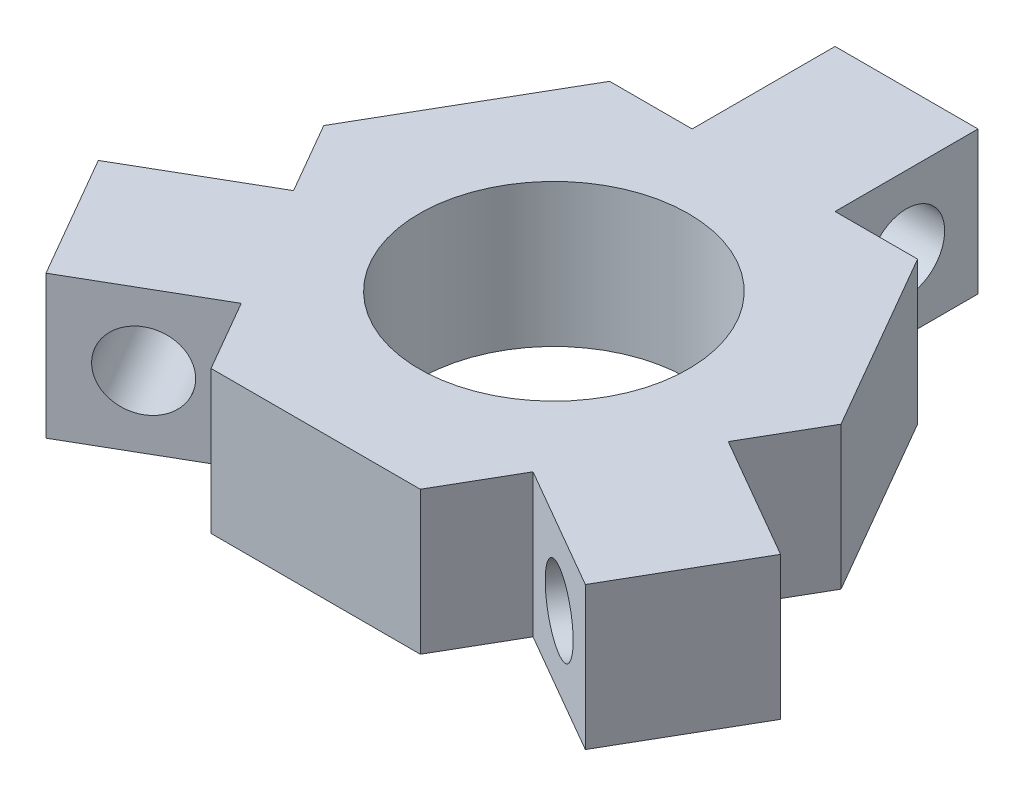
ISO-10303-21;
HEADER;
FILE_DESCRIPTION(('STEP AP214'),'2;1');
FILE_NAME('part.step','',(''),(''),'','','');
FILE_SCHEMA(('AUTOMOTIVE_DESIGN { 1 0 10303 214 1 1 1 1 }'));
ENDSEC;
DATA;
#1=APPLICATION_CONTEXT('core data for automotive mechanical design processes');
#2=APPLICATION_PROTOCOL_DEFINITION('international standard','automotive_design',2000,#1);
#3=PRODUCT_CONTEXT('',#1,'mechanical');
#4=PRODUCT('Part','Part','',(#3));
#5=PRODUCT_RELATED_PRODUCT_CATEGORY('part','',(#4));
#6=PRODUCT_DEFINITION_FORMATION('','',#4);
#7=PRODUCT_DEFINITION_CONTEXT('part definition',#1,'design');
#8=PRODUCT_DEFINITION('design','',#6,#7);
#9=PRODUCT_DEFINITION_SHAPE('','',#8);
#10=(LENGTH_UNIT() NAMED_UNIT(*) SI_UNIT(.MILLI.,.METRE.));
#11=(NAMED_UNIT(*) PLANE_ANGLE_UNIT() SI_UNIT($,.RADIAN.));
#12=(NAMED_UNIT(*) SI_UNIT($,.STERADIAN.) SOLID_ANGLE_UNIT());
#13=UNCERTAINTY_MEASURE_WITH_UNIT(LENGTH_MEASURE(1.E-05),#10,'distance_accuracy_value','');
#14=(GEOMETRIC_REPRESENTATION_CONTEXT(3) GLOBAL_UNCERTAINTY_ASSIGNED_CONTEXT((#13)) GLOBAL_UNIT_ASSIGNED_CONTEXT((#10,
#11,#12)) REPRESENTATION_CONTEXT('',''));
#15=CARTESIAN_POINT('',(0.,0.,0.));
#16=DIRECTION('',(0.,0.,1.));
#17=DIRECTION('',(1.,0.,0.));
#18=AXIS2_PLACEMENT_3D('',#15,#16,#17);
#19=CARTESIAN_POINT('',(-8.66025403784439,6.,-5.));
#20=DIRECTION('',(0.866025403784438,0.,0.5));
#21=DIRECTION('',(0.5,0.,-0.866025403784439));
#22=AXIS2_PLACEMENT_3D('',#19,#20,#21);
#23=PLANE('',#22);
#24=DIRECTION('',(-0.5,0.,0.866025403784439));
#25=VECTOR('',#24,1.);
#26=CARTESIAN_POINT('',(-8.66025403784439,0.,-5.));
#27=LINE('',#26,#25);
#28=CARTESIAN_POINT('',(-6.46410161513776,0.,-8.80384757729336));
#29=VERTEX_POINT('',#28);
#30=CARTESIAN_POINT('',(-10.856406460551,0.,-1.19615242270663));
#31=VERTEX_POINT('',#30);
#32=EDGE_CURVE('E197',#29,#31,#27,.T.);
#33=ORIENTED_EDGE('',*,*,#32,.T.);
#34=DIRECTION('',(0.,-1.,0.));
#35=VECTOR('',#34,1.);
#36=CARTESIAN_POINT('',(-10.856406460551,6.,-1.19615242270663));
#37=LINE('',#36,#35);
#38=CARTESIAN_POINT('',(-10.856406460551,6.,-1.19615242270663));
#39=VERTEX_POINT('',#38);
#40=EDGE_CURVE('E11',#39,#31,#37,.T.);
#41=ORIENTED_EDGE('',*,*,#40,.F.);
#42=DIRECTION('',(-0.5,0.,0.866025403784439));
#43=VECTOR('',#42,1.);
#44=CARTESIAN_POINT('',(-8.66025403784439,6.,-5.));
#45=LINE('',#44,#43);
#46=CARTESIAN_POINT('',(-6.46410161513776,6.,-8.80384757729336));
#47=VERTEX_POINT('',#46);
#48=EDGE_CURVE('E316',#47,#39,#45,.T.);
#49=ORIENTED_EDGE('',*,*,#48,.F.);
#50=DIRECTION('',(0.,-1.,0.));
#51=VECTOR('',#50,1.);
#52=CARTESIAN_POINT('',(-6.46410161513776,6.,-8.80384757729336));
#53=LINE('',#52,#51);
#54=EDGE_CURVE('E55',#47,#29,#53,.T.);
#55=ORIENTED_EDGE('',*,*,#54,.T.);
#56=EDGE_LOOP('',(#33,#41,#49,#55));
#57=FACE_BOUND('',#56,.T.);
#58=ADVANCED_FACE('F39',(#57),#23,.F.);
#59=CARTESIAN_POINT('',(-7.62435565298214,6.,4.40192378864669));
#60=DIRECTION('',(0.866025403784439,0.,-0.5));
#61=DIRECTION('',(-0.5,0.,-0.866025403784439));
#62=AXIS2_PLACEMENT_3D('',#59,#60,#61);
#63=PLANE('',#62);
#64=DIRECTION('',(0.5,0.,0.866025403784439));
#65=VECTOR('',#64,1.);
#66=CARTESIAN_POINT('',(-7.62435565298214,0.,4.40192378864669));
#67=LINE('',#66,#65);
#68=CARTESIAN_POINT('',(-9.12435565298214,0.,1.80384757729337));
#69=VERTEX_POINT('',#68);
#70=EDGE_CURVE('E199',#31,#69,#67,.T.);
#71=ORIENTED_EDGE('',*,*,#70,.T.);
#72=DIRECTION('',(0.,-1.,0.));
#73=VECTOR('',#72,1.);
#74=CARTESIAN_POINT('',(-9.12435565298214,6.,1.80384757729337));
#75=LINE('',#74,#73);
#76=CARTESIAN_POINT('',(-9.12435565298214,6.,1.80384757729337));
#77=VERTEX_POINT('',#76);
#78=EDGE_CURVE('E47',#77,#69,#75,.T.);
#79=ORIENTED_EDGE('',*,*,#78,.F.);
#80=DIRECTION('',(0.5,0.,0.866025403784439));
#81=VECTOR('',#80,1.);
#82=CARTESIAN_POINT('',(-7.62435565298214,6.,4.40192378864669));
#83=LINE('',#82,#81);
#84=EDGE_CURVE('E123',#39,#77,#83,.T.);
#85=ORIENTED_EDGE('',*,*,#84,.F.);
#86=ORIENTED_EDGE('',*,*,#40,.T.);
#87=EDGE_LOOP('',(#71,#79,#85,#86));
#88=FACE_BOUND('',#87,.T.);
#89=ADVANCED_FACE('F366',(#88),#63,.F.);
#90=CARTESIAN_POINT('',(-1.5,6.,-2.59807621135331));
#91=DIRECTION('',(0.5,0.,0.866025403784438));
#92=DIRECTION('',(0.866025403784439,0.,-0.5));
#93=AXIS2_PLACEMENT_3D('',#90,#91,#92);
#94=PLANE('',#93);
#95=CARTESIAN_POINT('',(-11.7224318643355,3.,3.30384757729338));
#96=DIRECTION('',(-0.5,0.,-0.866025403784439));
#97=DIRECTION('',(-0.866025403784439,0.,0.5));
#98=AXIS2_PLACEMENT_3D('',#95,#96,#97);
#99=CIRCLE('',#98,1.6);
#100=CARTESIAN_POINT('',(-13.1080725103906,3.,4.10384757729338));
#101=VERTEX_POINT('',#100);
#102=EDGE_CURVE('E320',#101,#101,#99,.T.);
#103=ORIENTED_EDGE('',*,*,#102,.F.);
#104=EDGE_LOOP('',(#103));
#105=FACE_BOUND('',#104,.T.);
#106=DIRECTION('',(-0.866025403784439,0.,0.5));
#107=VECTOR('',#106,1.);
#108=CARTESIAN_POINT('',(-1.5,0.,-2.59807621135331));
#109=LINE('',#108,#107);
#110=CARTESIAN_POINT('',(-14.3205080756888,0.,4.80384757729338));
#111=VERTEX_POINT('',#110);
#112=EDGE_CURVE('E202',#69,#111,#109,.T.);
#113=ORIENTED_EDGE('',*,*,#112,.T.);
#114=DIRECTION('',(0.,-1.,0.));
#115=VECTOR('',#114,1.);
#116=CARTESIAN_POINT('',(-14.3205080756888,6.,4.80384757729338));
#117=LINE('',#116,#115);
#118=CARTESIAN_POINT('',(-14.3205080756888,6.,4.80384757729338));
#119=VERTEX_POINT('',#118);
#120=EDGE_CURVE('E267',#119,#111,#117,.T.);
#121=ORIENTED_EDGE('',*,*,#120,.F.);
#122=DIRECTION('',(-0.866025403784439,0.,0.5));
#123=VECTOR('',#122,1.);
#124=CARTESIAN_POINT('',(-1.5,6.,-2.59807621135331));
#125=LINE('',#124,#123);
#126=EDGE_CURVE('E275',#77,#119,#125,.T.);
#127=ORIENTED_EDGE('',*,*,#126,.F.);
#128=ORIENTED_EDGE('',*,*,#78,.T.);
#129=EDGE_LOOP('',(#113,#121,#127,#128));
#130=FACE_BOUND('',#129,.T.);
#131=ADVANCED_FACE('F273',(#105,#130),#94,.F.);
#132=CARTESIAN_POINT('',(-12.8205080756888,6.,7.40192378864669));
#133=DIRECTION('',(0.866025403784438,0.,-0.5));
#134=DIRECTION('',(-0.5,0.,-0.866025403784439));
#135=AXIS2_PLACEMENT_3D('',#132,#133,#134);
#136=PLANE('',#135);
#137=DIRECTION('',(0.5,0.,0.866025403784439));
#138=VECTOR('',#137,1.);
#139=CARTESIAN_POINT('',(-12.8205080756888,0.,7.40192378864669));
#140=LINE('',#139,#138);
#141=CARTESIAN_POINT('',(-11.3205080756888,0.,10.));
#142=VERTEX_POINT('',#141);
#143=EDGE_CURVE('E205',#111,#142,#140,.T.);
#144=ORIENTED_EDGE('',*,*,#143,.T.);
#145=DIRECTION('',(0.,-1.,0.));
#146=VECTOR('',#145,1.);
#147=CARTESIAN_POINT('',(-11.3205080756888,6.,10.));
#148=LINE('',#147,#146);
#149=CARTESIAN_POINT('',(-11.3205080756888,6.,10.));
#150=VERTEX_POINT('',#149);
#151=EDGE_CURVE('E264',#150,#142,#148,.T.);
#152=ORIENTED_EDGE('',*,*,#151,.F.);
#153=DIRECTION('',(0.5,0.,0.866025403784439));
#154=VECTOR('',#153,1.);
#155=CARTESIAN_POINT('',(-12.8205080756888,6.,7.40192378864669));
#156=LINE('',#155,#154);
#157=EDGE_CURVE('E292',#119,#150,#156,.T.);
#158=ORIENTED_EDGE('',*,*,#157,.F.);
#159=ORIENTED_EDGE('',*,*,#120,.T.);
#160=EDGE_LOOP('',(#144,#152,#158,#159));
#161=FACE_BOUND('',#160,.T.);
#162=ADVANCED_FACE('F283',(#161),#136,.F.);
#163=CARTESIAN_POINT('',(1.5,6.,2.59807621135332));
#164=DIRECTION('',(-0.5,0.,-0.866025403784438));
#165=DIRECTION('',(-0.866025403784439,0.,0.5));
#166=AXIS2_PLACEMENT_3D('',#163,#164,#165);
#167=PLANE('',#166);
#168=CARTESIAN_POINT('',(-8.72243186433546,3.,8.50000000000001));
#169=DIRECTION('',(-0.5,0.,-0.866025403784439));
#170=DIRECTION('',(-0.866025403784439,0.,0.5));
#171=AXIS2_PLACEMENT_3D('',#168,#169,#170);
#172=CIRCLE('',#171,1.6);
#173=CARTESIAN_POINT('',(-10.1080725103906,3.,9.30000000000001));
#174=VERTEX_POINT('',#173);
#175=EDGE_CURVE('E200',#174,#174,#172,.T.);
#176=ORIENTED_EDGE('',*,*,#175,.T.);
#177=EDGE_LOOP('',(#176));
#178=FACE_BOUND('',#177,.T.);
#179=DIRECTION('',(0.866025403784439,0.,-0.5));
#180=VECTOR('',#179,1.);
#181=CARTESIAN_POINT('',(1.5,0.,2.59807621135332));
#182=LINE('',#181,#180);
#183=CARTESIAN_POINT('',(-6.12435565298214,0.,7.00000000000001));
#184=VERTEX_POINT('',#183);
#185=EDGE_CURVE('E207',#142,#184,#182,.T.);
#186=ORIENTED_EDGE('',*,*,#185,.T.);
#187=DIRECTION('',(0.,-1.,0.));
#188=VECTOR('',#187,1.);
#189=CARTESIAN_POINT('',(-6.12435565298214,6.,7.00000000000001));
#190=LINE('',#189,#188);
#191=CARTESIAN_POINT('',(-6.12435565298214,6.,7.00000000000001));
#192=VERTEX_POINT('',#191);
#193=EDGE_CURVE('E261',#192,#184,#190,.T.);
#194=ORIENTED_EDGE('',*,*,#193,.F.);
#195=DIRECTION('',(0.866025403784439,0.,-0.5));
#196=VECTOR('',#195,1.);
#197=CARTESIAN_POINT('',(1.5,6.,2.59807621135332));
#198=LINE('',#197,#196);
#199=EDGE_CURVE('E289',#150,#192,#198,.T.);
#200=ORIENTED_EDGE('',*,*,#199,.F.);
#201=ORIENTED_EDGE('',*,*,#151,.T.);
#202=EDGE_LOOP('',(#186,#194,#200,#201));
#203=FACE_BOUND('',#202,.T.);
#204=ADVANCED_FACE('F287',(#178,#203),#167,.F.);
#205=CARTESIAN_POINT('',(-4.39230484541326,0.,10.));
#206=VERTEX_POINT('',#205);
#207=EDGE_CURVE('E203',#184,#206,#67,.T.);
#208=ORIENTED_EDGE('',*,*,#207,.T.);
#209=DIRECTION('',(0.,-1.,0.));
#210=VECTOR('',#209,1.);
#211=CARTESIAN_POINT('',(-4.39230484541326,6.,10.));
#212=LINE('',#211,#210);
#213=CARTESIAN_POINT('',(-4.39230484541326,6.,10.));
#214=VERTEX_POINT('',#213);
#215=EDGE_CURVE('E258',#214,#206,#212,.T.);
#216=ORIENTED_EDGE('',*,*,#215,.F.);
#217=EDGE_CURVE('E291',#192,#214,#83,.T.);
#218=ORIENTED_EDGE('',*,*,#217,.F.);
#219=ORIENTED_EDGE('',*,*,#193,.T.);
#220=EDGE_LOOP('',(#208,#216,#218,#219));
#221=FACE_BOUND('',#220,.T.);
#222=ADVANCED_FACE('F371',(#221),#63,.F.);
#223=CARTESIAN_POINT('',(0.,6.,10.));
#224=DIRECTION('',(0.,0.,-1.));
#225=DIRECTION('',(-1.,0.,0.));
#226=AXIS2_PLACEMENT_3D('',#223,#224,#225);
#227=PLANE('',#226);
#228=DIRECTION('',(1.,0.,0.));
#229=VECTOR('',#228,1.);
#230=CARTESIAN_POINT('',(0.,0.,10.));
#231=LINE('',#230,#229);
#232=CARTESIAN_POINT('',(4.39230484541327,0.,10.));
#233=VERTEX_POINT('',#232);
#234=EDGE_CURVE('E209',#206,#233,#231,.T.);
#235=ORIENTED_EDGE('',*,*,#234,.T.);
#236=DIRECTION('',(0.,-1.,0.));
#237=VECTOR('',#236,1.);
#238=CARTESIAN_POINT('',(4.39230484541327,6.,10.));
#239=LINE('',#238,#237);
#240=CARTESIAN_POINT('',(4.39230484541327,6.,10.));
#241=VERTEX_POINT('',#240);
#242=EDGE_CURVE('E255',#241,#233,#239,.T.);
#243=ORIENTED_EDGE('',*,*,#242,.F.);
#244=DIRECTION('',(1.,0.,0.));
#245=VECTOR('',#244,1.);
#246=CARTESIAN_POINT('',(0.,6.,10.));
#247=LINE('',#246,#245);
#248=EDGE_CURVE('E294',#214,#241,#247,.T.);
#249=ORIENTED_EDGE('',*,*,#248,.F.);
#250=ORIENTED_EDGE('',*,*,#215,.T.);
#251=EDGE_LOOP('',(#235,#243,#249,#250));
#252=FACE_BOUND('',#251,.T.);
#253=ADVANCED_FACE('F421',(#252),#227,.F.);
#254=CARTESIAN_POINT('',(7.62435565298215,6.,4.40192378864669));
#255=DIRECTION('',(-0.866025403784439,0.,-0.5));
#256=DIRECTION('',(-0.5,0.,0.866025403784439));
#257=AXIS2_PLACEMENT_3D('',#254,#255,#256);
#258=PLANE('',#257);
#259=DIRECTION('',(0.5,0.,-0.866025403784439));
#260=VECTOR('',#259,1.);
#261=CARTESIAN_POINT('',(7.62435565298215,0.,4.40192378864669));
#262=LINE('',#261,#260);
#263=CARTESIAN_POINT('',(6.12435565298215,0.,7.));
#264=VERTEX_POINT('',#263);
#265=EDGE_CURVE('E211',#233,#264,#262,.T.);
#266=ORIENTED_EDGE('',*,*,#265,.T.);
#267=DIRECTION('',(0.,-1.,0.));
#268=VECTOR('',#267,1.);
#269=CARTESIAN_POINT('',(6.12435565298215,6.,7.));
#270=LINE('',#269,#268);
#271=CARTESIAN_POINT('',(6.12435565298215,6.,7.));
#272=VERTEX_POINT('',#271);
#273=EDGE_CURVE('E252',#272,#264,#270,.T.);
#274=ORIENTED_EDGE('',*,*,#273,.F.);
#275=DIRECTION('',(0.5,0.,-0.866025403784439));
#276=VECTOR('',#275,1.);
#277=CARTESIAN_POINT('',(7.62435565298215,6.,4.40192378864669));
#278=LINE('',#277,#276);
#279=EDGE_CURVE('E300',#241,#272,#278,.T.);
#280=ORIENTED_EDGE('',*,*,#279,.F.);
#281=ORIENTED_EDGE('',*,*,#242,.T.);
#282=EDGE_LOOP('',(#266,#274,#280,#281));
#283=FACE_BOUND('',#282,.T.);
#284=ADVANCED_FACE('F417',(#283),#258,.F.);
#285=CARTESIAN_POINT('',(-1.5,6.,2.59807621135332));
#286=DIRECTION('',(0.5,0.,-0.866025403784439));
#287=DIRECTION('',(-0.866025403784439,0.,-0.5));
#288=AXIS2_PLACEMENT_3D('',#285,#286,#287);
#289=PLANE('',#288);
#290=CARTESIAN_POINT('',(8.72243186433546,3.,8.5));
#291=DIRECTION('',(-0.5,0.,0.866025403784439));
#292=DIRECTION('',(0.866025403784439,0.,0.5));
#293=AXIS2_PLACEMENT_3D('',#290,#291,#292);
#294=CIRCLE('',#293,1.6);
#295=CARTESIAN_POINT('',(10.1080725103906,3.,9.3));
#296=VERTEX_POINT('',#295);
#297=EDGE_CURVE('E332',#296,#296,#294,.T.);
#298=ORIENTED_EDGE('',*,*,#297,.F.);
#299=EDGE_LOOP('',(#298));
#300=FACE_BOUND('',#299,.T.);
#301=DIRECTION('',(0.866025403784439,0.,0.5));
#302=VECTOR('',#301,1.);
#303=CARTESIAN_POINT('',(-1.5,0.,2.59807621135332));
#304=LINE('',#303,#302);
#305=CARTESIAN_POINT('',(11.3205080756888,0.,10.));
#306=VERTEX_POINT('',#305);
#307=EDGE_CURVE('E213',#264,#306,#304,.T.);
#308=ORIENTED_EDGE('',*,*,#307,.T.);
#309=DIRECTION('',(0.,-1.,0.));
#310=VECTOR('',#309,1.);
#311=CARTESIAN_POINT('',(11.3205080756888,6.,10.));
#312=LINE('',#311,#310);
#313=CARTESIAN_POINT('',(11.3205080756888,6.,10.));
#314=VERTEX_POINT('',#313);
#315=EDGE_CURVE('E249',#314,#306,#312,.T.);
#316=ORIENTED_EDGE('',*,*,#315,.F.);
#317=DIRECTION('',(0.866025403784439,0.,0.5));
#318=VECTOR('',#317,1.);
#319=CARTESIAN_POINT('',(-1.5,6.,2.59807621135332));
#320=LINE('',#319,#318);
#321=EDGE_CURVE('E302',#272,#314,#320,.T.);
#322=ORIENTED_EDGE('',*,*,#321,.F.);
#323=ORIENTED_EDGE('',*,*,#273,.T.);
#324=EDGE_LOOP('',(#308,#316,#322,#323));
#325=FACE_BOUND('',#324,.T.);
#326=ADVANCED_FACE('F413',(#300,#325),#289,.F.);
#327=CARTESIAN_POINT('',(12.8205080756888,6.,7.40192378864669));
#328=DIRECTION('',(-0.866025403784439,0.,-0.5));
#329=DIRECTION('',(-0.5,0.,0.866025403784439));
#330=AXIS2_PLACEMENT_3D('',#327,#328,#329);
#331=PLANE('',#330);
#332=DIRECTION('',(0.5,0.,-0.866025403784439));
#333=VECTOR('',#332,1.);
#334=CARTESIAN_POINT('',(12.8205080756888,0.,7.40192378864669));
#335=LINE('',#334,#333);
#336=CARTESIAN_POINT('',(14.3205080756888,0.,4.80384757729337));
#337=VERTEX_POINT('',#336);
#338=EDGE_CURVE('E216',#306,#337,#335,.T.);
#339=ORIENTED_EDGE('',*,*,#338,.T.);
#340=DIRECTION('',(0.,-1.,0.));
#341=VECTOR('',#340,1.);
#342=CARTESIAN_POINT('',(14.3205080756888,6.,4.80384757729337));
#343=LINE('',#342,#341);
#344=CARTESIAN_POINT('',(14.3205080756888,6.,4.80384757729337));
#345=VERTEX_POINT('',#344);
#346=EDGE_CURVE('E246',#345,#337,#343,.T.);
#347=ORIENTED_EDGE('',*,*,#346,.F.);
#348=DIRECTION('',(0.5,0.,-0.866025403784439));
#349=VECTOR('',#348,1.);
#350=CARTESIAN_POINT('',(12.8205080756888,6.,7.40192378864669));
#351=LINE('',#350,#349);
#352=EDGE_CURVE('E305',#314,#345,#351,.T.);
#353=ORIENTED_EDGE('',*,*,#352,.F.);
#354=ORIENTED_EDGE('',*,*,#315,.T.);
#355=EDGE_LOOP('',(#339,#347,#353,#354));
#356=FACE_BOUND('',#355,.T.);
#357=ADVANCED_FACE('F408',(#356),#331,.F.);
#358=CARTESIAN_POINT('',(1.5,6.,-2.59807621135331));
#359=DIRECTION('',(-0.5,0.,0.866025403784439));
#360=DIRECTION('',(0.866025403784439,0.,0.5));
#361=AXIS2_PLACEMENT_3D('',#358,#359,#360);
#362=PLANE('',#361);
#363=CARTESIAN_POINT('',(11.7224318643355,3.,3.30384757729337));
#364=DIRECTION('',(-0.5,0.,0.866025403784439));
#365=DIRECTION('',(0.866025403784439,0.,0.5));
#366=AXIS2_PLACEMENT_3D('',#363,#364,#365);
#367=CIRCLE('',#366,1.6);
#368=CARTESIAN_POINT('',(13.1080725103906,3.,4.10384757729337));
#369=VERTEX_POINT('',#368);
#370=EDGE_CURVE('E329',#369,#369,#367,.T.);
#371=ORIENTED_EDGE('',*,*,#370,.T.);
#372=EDGE_LOOP('',(#371));
#373=FACE_BOUND('',#372,.T.);
#374=DIRECTION('',(-0.866025403784439,0.,-0.5));
#375=VECTOR('',#374,1.);
#376=CARTESIAN_POINT('',(1.5,0.,-2.59807621135331));
#377=LINE('',#376,#375);
#378=CARTESIAN_POINT('',(9.12435565298215,0.,1.80384757729337));
#379=VERTEX_POINT('',#378);
#380=EDGE_CURVE('E218',#337,#379,#377,.T.);
#381=ORIENTED_EDGE('',*,*,#380,.T.);
#382=DIRECTION('',(0.,-1.,0.));
#383=VECTOR('',#382,1.);
#384=CARTESIAN_POINT('',(9.12435565298215,6.,1.80384757729337));
#385=LINE('',#384,#383);
#386=CARTESIAN_POINT('',(9.12435565298215,6.,1.80384757729337));
#387=VERTEX_POINT('',#386);
#388=EDGE_CURVE('E243',#387,#379,#385,.T.);
#389=ORIENTED_EDGE('',*,*,#388,.F.);
#390=DIRECTION('',(-0.866025403784439,0.,-0.5));
#391=VECTOR('',#390,1.);
#392=CARTESIAN_POINT('',(1.5,6.,-2.59807621135331));
#393=LINE('',#392,#391);
#394=EDGE_CURVE('E307',#345,#387,#393,.T.);
#395=ORIENTED_EDGE('',*,*,#394,.F.);
#396=ORIENTED_EDGE('',*,*,#346,.T.);
#397=EDGE_LOOP('',(#381,#389,#395,#396));
#398=FACE_BOUND('',#397,.T.);
#399=ADVANCED_FACE('F402',(#373,#398),#362,.F.);
#400=CARTESIAN_POINT('',(10.856406460551,0.,-1.19615242270663));
#401=VERTEX_POINT('',#400);
#402=EDGE_CURVE('E214',#379,#401,#262,.T.);
#403=ORIENTED_EDGE('',*,*,#402,.T.);
#404=DIRECTION('',(0.,-1.,0.));
#405=VECTOR('',#404,1.);
#406=CARTESIAN_POINT('',(10.856406460551,6.,-1.19615242270663));
#407=LINE('',#406,#405);
#408=CARTESIAN_POINT('',(10.856406460551,6.,-1.19615242270663));
#409=VERTEX_POINT('',#408);
#410=EDGE_CURVE('E240',#409,#401,#407,.T.);
#411=ORIENTED_EDGE('',*,*,#410,.F.);
#412=EDGE_CURVE('E303',#387,#409,#278,.T.);
#413=ORIENTED_EDGE('',*,*,#412,.F.);
#414=ORIENTED_EDGE('',*,*,#388,.T.);
#415=EDGE_LOOP('',(#403,#411,#413,#414));
#416=FACE_BOUND('',#415,.T.);
#417=ADVANCED_FACE('F388',(#416),#258,.F.);
#418=CARTESIAN_POINT('',(8.66025403784439,6.,-5.));
#419=DIRECTION('',(-0.866025403784438,0.,0.5));
#420=DIRECTION('',(0.5,0.,0.866025403784439));
#421=AXIS2_PLACEMENT_3D('',#418,#419,#420);
#422=PLANE('',#421);
#423=DIRECTION('',(-0.5,0.,-0.866025403784439));
#424=VECTOR('',#423,1.);
#425=CARTESIAN_POINT('',(8.66025403784439,0.,-5.));
#426=LINE('',#425,#424);
#427=CARTESIAN_POINT('',(6.46410161513776,0.,-8.80384757729336));
#428=VERTEX_POINT('',#427);
#429=EDGE_CURVE('E220',#401,#428,#426,.T.);
#430=ORIENTED_EDGE('',*,*,#429,.T.);
#431=DIRECTION('',(0.,-1.,0.));
#432=VECTOR('',#431,1.);
#433=CARTESIAN_POINT('',(6.46410161513776,6.,-8.80384757729336));
#434=LINE('',#433,#432);
#435=CARTESIAN_POINT('',(6.46410161513776,6.,-8.80384757729336));
#436=VERTEX_POINT('',#435);
#437=EDGE_CURVE('E238',#436,#428,#434,.T.);
#438=ORIENTED_EDGE('',*,*,#437,.F.);
#439=DIRECTION('',(-0.5,0.,-0.866025403784439));
#440=VECTOR('',#439,1.);
#441=CARTESIAN_POINT('',(8.66025403784439,6.,-5.));
#442=LINE('',#441,#440);
#443=EDGE_CURVE('E309',#409,#436,#442,.T.);
#444=ORIENTED_EDGE('',*,*,#443,.F.);
#445=ORIENTED_EDGE('',*,*,#410,.T.);
#446=EDGE_LOOP('',(#430,#438,#444,#445));
#447=FACE_BOUND('',#446,.T.);
#448=ADVANCED_FACE('F380',(#447),#422,.F.);
#449=CARTESIAN_POINT('',(0.,6.,-8.80384757729336));
#450=DIRECTION('',(0.,0.,-1.));
#451=DIRECTION('',(-1.,0.,0.));
#452=AXIS2_PLACEMENT_3D('',#449,#450,#451);
#453=PLANE('',#452);
#454=DIRECTION('',(1.,0.,0.));
#455=VECTOR('',#454,1.);
#456=CARTESIAN_POINT('',(0.,0.,-8.80384757729336));
#457=LINE('',#456,#455);
#458=CARTESIAN_POINT('',(3.,0.,-8.80384757729336));
#459=VERTEX_POINT('',#458);
#460=EDGE_CURVE('E223',#459,#428,#457,.T.);
#461=ORIENTED_EDGE('',*,*,#460,.F.);
#462=DIRECTION('',(0.,-1.,0.));
#463=VECTOR('',#462,1.);
#464=CARTESIAN_POINT('',(3.,6.,-8.80384757729336));
#465=LINE('',#464,#463);
#466=CARTESIAN_POINT('',(3.,6.,-8.80384757729336));
#467=VERTEX_POINT('',#466);
#468=EDGE_CURVE('E236',#467,#459,#465,.T.);
#469=ORIENTED_EDGE('',*,*,#468,.F.);
#470=DIRECTION('',(1.,0.,0.));
#471=VECTOR('',#470,1.);
#472=CARTESIAN_POINT('',(0.,6.,-8.80384757729336));
#473=LINE('',#472,#471);
#474=EDGE_CURVE('E194',#467,#436,#473,.T.);
#475=ORIENTED_EDGE('',*,*,#474,.T.);
#476=ORIENTED_EDGE('',*,*,#437,.T.);
#477=EDGE_LOOP('',(#461,#469,#475,#476));
#478=FACE_BOUND('',#477,.T.);
#479=ADVANCED_FACE('F373',(#478),#453,.T.);
#480=CARTESIAN_POINT('',(3.,6.,0.));
#481=DIRECTION('',(1.,0.,0.));
#482=DIRECTION('',(0.,0.,-1.));
#483=AXIS2_PLACEMENT_3D('',#480,#481,#482);
#484=PLANE('',#483);
#485=CARTESIAN_POINT('',(3.,3.,-11.8038475772934));
#486=DIRECTION('',(1.,0.,0.));
#487=DIRECTION('',(0.,0.,-1.));
#488=AXIS2_PLACEMENT_3D('',#485,#486,#487);
#489=CIRCLE('',#488,1.6);
#490=CARTESIAN_POINT('',(3.,3.,-13.4038475772934));
#491=VERTEX_POINT('',#490);
#492=EDGE_CURVE('E326',#491,#491,#489,.T.);
#493=ORIENTED_EDGE('',*,*,#492,.F.);
#494=EDGE_LOOP('',(#493));
#495=FACE_BOUND('',#494,.T.);
#496=DIRECTION('',(0.,0.,1.));
#497=VECTOR('',#496,1.);
#498=CARTESIAN_POINT('',(3.,0.,0.));
#499=LINE('',#498,#497);
#500=CARTESIAN_POINT('',(3.00000000000001,0.,-14.8038475772934));
#501=VERTEX_POINT('',#500);
#502=EDGE_CURVE('E226',#501,#459,#499,.T.);
#503=ORIENTED_EDGE('',*,*,#502,.F.);
#504=DIRECTION('',(0.,-1.,0.));
#505=VECTOR('',#504,1.);
#506=CARTESIAN_POINT('',(3.00000000000001,6.,-14.8038475772934));
#507=LINE('',#506,#505);
#508=CARTESIAN_POINT('',(3.00000000000001,6.,-14.8038475772934));
#509=VERTEX_POINT('',#508);
#510=EDGE_CURVE('E178',#509,#501,#507,.T.);
#511=ORIENTED_EDGE('',*,*,#510,.F.);
#512=DIRECTION('',(0.,0.,1.));
#513=VECTOR('',#512,1.);
#514=CARTESIAN_POINT('',(3.,6.,0.));
#515=LINE('',#514,#513);
#516=EDGE_CURVE('E188',#509,#467,#515,.T.);
#517=ORIENTED_EDGE('',*,*,#516,.T.);
#518=ORIENTED_EDGE('',*,*,#468,.T.);
#519=EDGE_LOOP('',(#503,#511,#517,#518));
#520=FACE_BOUND('',#519,.T.);
#521=ADVANCED_FACE('F313',(#495,#520),#484,.T.);
#522=CARTESIAN_POINT('',(0.,6.,-14.8038475772934));
#523=DIRECTION('',(0.,0.,-1.));
#524=DIRECTION('',(-1.,0.,0.));
#525=AXIS2_PLACEMENT_3D('',#522,#523,#524);
#526=PLANE('',#525);
#527=DIRECTION('',(1.,0.,0.));
#528=VECTOR('',#527,1.);
#529=CARTESIAN_POINT('',(0.,0.,-14.8038475772934));
#530=LINE('',#529,#528);
#531=CARTESIAN_POINT('',(-3.,0.,-14.8038475772934));
#532=VERTEX_POINT('',#531);
#533=EDGE_CURVE('E174',#532,#501,#530,.T.);
#534=ORIENTED_EDGE('',*,*,#533,.F.);
#535=DIRECTION('',(0.,-1.,0.));
#536=VECTOR('',#535,1.);
#537=CARTESIAN_POINT('',(-3.,6.,-14.8038475772934));
#538=LINE('',#537,#536);
#539=CARTESIAN_POINT('',(-3.,6.,-14.8038475772934));
#540=VERTEX_POINT('',#539);
#541=EDGE_CURVE('E169',#540,#532,#538,.T.);
#542=ORIENTED_EDGE('',*,*,#541,.F.);
#543=DIRECTION('',(1.,0.,0.));
#544=VECTOR('',#543,1.);
#545=CARTESIAN_POINT('',(0.,6.,-14.8038475772934));
#546=LINE('',#545,#544);
#547=EDGE_CURVE('E172',#540,#509,#546,.T.);
#548=ORIENTED_EDGE('',*,*,#547,.T.);
#549=ORIENTED_EDGE('',*,*,#510,.T.);
#550=EDGE_LOOP('',(#534,#542,#548,#549));
#551=FACE_BOUND('',#550,.T.);
#552=ADVANCED_FACE('F171',(#551),#526,.T.);
#553=CARTESIAN_POINT('',(-3.,6.,0.));
#554=DIRECTION('',(-1.,0.,0.));
#555=DIRECTION('',(0.,0.,1.));
#556=AXIS2_PLACEMENT_3D('',#553,#554,#555);
#557=PLANE('',#556);
#558=CARTESIAN_POINT('',(-3.,3.,-11.8038475772934));
#559=DIRECTION('',(1.,0.,0.));
#560=DIRECTION('',(0.,0.,-1.));
#561=AXIS2_PLACEMENT_3D('',#558,#559,#560);
#562=CIRCLE('',#561,1.6);
#563=CARTESIAN_POINT('',(-3.,3.,-13.4038475772934));
#564=VERTEX_POINT('',#563);
#565=EDGE_CURVE('E323',#564,#564,#562,.T.);
#566=ORIENTED_EDGE('',*,*,#565,.T.);
#567=EDGE_LOOP('',(#566));
#568=FACE_BOUND('',#567,.T.);
#569=DIRECTION('',(0.,0.,-1.));
#570=VECTOR('',#569,1.);
#571=CARTESIAN_POINT('',(-3.,0.,0.));
#572=LINE('',#571,#570);
#573=CARTESIAN_POINT('',(-3.,0.,-8.80384757729336));
#574=VERTEX_POINT('',#573);
#575=EDGE_CURVE('E231',#574,#532,#572,.T.);
#576=ORIENTED_EDGE('',*,*,#575,.F.);
#577=DIRECTION('',(0.,-1.,0.));
#578=VECTOR('',#577,1.);
#579=CARTESIAN_POINT('',(-3.,6.,-8.80384757729336));
#580=LINE('',#579,#578);
#581=CARTESIAN_POINT('',(-3.,6.,-8.80384757729336));
#582=VERTEX_POINT('',#581);
#583=EDGE_CURVE('E111',#582,#574,#580,.T.);
#584=ORIENTED_EDGE('',*,*,#583,.F.);
#585=DIRECTION('',(0.,0.,-1.));
#586=VECTOR('',#585,1.);
#587=CARTESIAN_POINT('',(-3.,6.,0.));
#588=LINE('',#587,#586);
#589=EDGE_CURVE('E185',#582,#540,#588,.T.);
#590=ORIENTED_EDGE('',*,*,#589,.T.);
#591=ORIENTED_EDGE('',*,*,#541,.T.);
#592=EDGE_LOOP('',(#576,#584,#590,#591));
#593=FACE_BOUND('',#592,.T.);
#594=ADVANCED_FACE('F190',(#568,#593),#557,.T.);
#595=EDGE_CURVE('E227',#29,#574,#457,.T.);
#596=ORIENTED_EDGE('',*,*,#595,.F.);
#597=ORIENTED_EDGE('',*,*,#54,.F.);
#598=EDGE_CURVE('E191',#47,#582,#473,.T.);
#599=ORIENTED_EDGE('',*,*,#598,.T.);
#600=ORIENTED_EDGE('',*,*,#583,.T.);
#601=EDGE_LOOP('',(#596,#597,#599,#600));
#602=FACE_BOUND('',#601,.T.);
#603=ADVANCED_FACE('F362',(#602),#453,.T.);
#604=CARTESIAN_POINT('',(0.,6.,0.));
#605=DIRECTION('',(0.,1.,0.));
#606=DIRECTION('',(0.,0.,1.));
#607=AXIS2_PLACEMENT_3D('',#604,#605,#606);
#608=PLANE('',#607);
#609=CARTESIAN_POINT('',(0.,6.,0.));
#610=DIRECTION('',(0.,-1.,0.));
#611=DIRECTION('',(0.,0.,-1.));
#612=AXIS2_PLACEMENT_3D('',#609,#610,#611);
#613=CIRCLE('',#612,5.65);
#614=CARTESIAN_POINT('',(0.,6.,-5.65));
#615=VERTEX_POINT('',#614);
#616=EDGE_CURVE('E335',#615,#615,#613,.T.);
#617=ORIENTED_EDGE('',*,*,#616,.T.);
#618=EDGE_LOOP('',(#617));
#619=FACE_BOUND('',#618,.T.);
#620=ORIENTED_EDGE('',*,*,#48,.T.);
#621=ORIENTED_EDGE('',*,*,#84,.T.);
#622=ORIENTED_EDGE('',*,*,#126,.T.);
#623=ORIENTED_EDGE('',*,*,#157,.T.);
#624=ORIENTED_EDGE('',*,*,#199,.T.);
#625=ORIENTED_EDGE('',*,*,#217,.T.);
#626=ORIENTED_EDGE('',*,*,#248,.T.);
#627=ORIENTED_EDGE('',*,*,#279,.T.);
#628=ORIENTED_EDGE('',*,*,#321,.T.);
#629=ORIENTED_EDGE('',*,*,#352,.T.);
#630=ORIENTED_EDGE('',*,*,#394,.T.);
#631=ORIENTED_EDGE('',*,*,#412,.T.);
#632=ORIENTED_EDGE('',*,*,#443,.T.);
#633=ORIENTED_EDGE('',*,*,#474,.F.);
#634=ORIENTED_EDGE('',*,*,#516,.F.);
#635=ORIENTED_EDGE('',*,*,#547,.F.);
#636=ORIENTED_EDGE('',*,*,#589,.F.);
#637=ORIENTED_EDGE('',*,*,#598,.F.);
#638=EDGE_LOOP('',(#620,#621,#622,#623,#624,#625,#626,#627,#628,#629,#630,#631,#632,#633,#634,
#635,#636,#637));
#639=FACE_BOUND('',#638,.T.);
#640=ADVANCED_FACE('F183',(#619,#639),#608,.T.);
#641=CARTESIAN_POINT('',(0.,0.,0.));
#642=DIRECTION('',(0.,1.,0.));
#643=DIRECTION('',(0.,0.,1.));
#644=AXIS2_PLACEMENT_3D('',#641,#642,#643);
#645=PLANE('',#644);
#646=CARTESIAN_POINT('',(0.,0.,0.));
#647=DIRECTION('',(0.,-1.,0.));
#648=DIRECTION('',(0.,0.,-1.));
#649=AXIS2_PLACEMENT_3D('',#646,#647,#648);
#650=CIRCLE('',#649,5.65);
#651=CARTESIAN_POINT('',(0.,0.,-5.65));
#652=VERTEX_POINT('',#651);
#653=EDGE_CURVE('E338',#652,#652,#650,.T.);
#654=ORIENTED_EDGE('',*,*,#653,.F.);
#655=EDGE_LOOP('',(#654));
#656=FACE_BOUND('',#655,.T.);
#657=ORIENTED_EDGE('',*,*,#32,.F.);
#658=ORIENTED_EDGE('',*,*,#595,.T.);
#659=ORIENTED_EDGE('',*,*,#575,.T.);
#660=ORIENTED_EDGE('',*,*,#533,.T.);
#661=ORIENTED_EDGE('',*,*,#502,.T.);
#662=ORIENTED_EDGE('',*,*,#460,.T.);
#663=ORIENTED_EDGE('',*,*,#429,.F.);
#664=ORIENTED_EDGE('',*,*,#402,.F.);
#665=ORIENTED_EDGE('',*,*,#380,.F.);
#666=ORIENTED_EDGE('',*,*,#338,.F.);
#667=ORIENTED_EDGE('',*,*,#307,.F.);
#668=ORIENTED_EDGE('',*,*,#265,.F.);
#669=ORIENTED_EDGE('',*,*,#234,.F.);
#670=ORIENTED_EDGE('',*,*,#207,.F.);
#671=ORIENTED_EDGE('',*,*,#185,.F.);
#672=ORIENTED_EDGE('',*,*,#143,.F.);
#673=ORIENTED_EDGE('',*,*,#112,.F.);
#674=ORIENTED_EDGE('',*,*,#70,.F.);
#675=EDGE_LOOP('',(#657,#658,#659,#660,#661,#662,#663,#664,#665,#666,#667,#668,#669,#670,#671,
#672,#673,#674));
#676=FACE_BOUND('',#675,.T.);
#677=ADVANCED_FACE('F278',(#656,#676),#645,.F.);
#678=CARTESIAN_POINT('',(-8.72243186433546,3.,8.50000000000001));
#679=DIRECTION('',(-0.5,0.,-0.866025403784438));
#680=DIRECTION('',(-0.866025403784439,0.,0.5));
#681=AXIS2_PLACEMENT_3D('',#678,#679,#680);
#682=CYLINDRICAL_SURFACE('',#681,1.6);
#683=CARTESIAN_POINT('',(-10.1080725103906,3.,9.30000000000001));
#684=CARTESIAN_POINT('',(-10.1393225103906,3.,9.24587341226349));
#685=CARTESIAN_POINT('',(-10.1705725103906,3.,9.19174682452696));
#686=CARTESIAN_POINT('',(-10.2330725103906,3.,9.0834936490539));
#687=CARTESIAN_POINT('',(-10.2643225103906,3.,9.02936706131737));
#688=CARTESIAN_POINT('',(-10.3268225103906,3.,8.92111388584432));
#689=CARTESIAN_POINT('',(-10.3580725103906,3.,8.86698729810779));
#690=CARTESIAN_POINT('',(-10.4205725103906,3.,8.75873412263474));
#691=CARTESIAN_POINT('',(-10.4518225103906,3.,8.70460753489821));
#692=CARTESIAN_POINT('',(-10.5143225103906,3.,8.59635435942515));
#693=CARTESIAN_POINT('',(-10.5455725103906,3.,8.54222777168863));
#694=CARTESIAN_POINT('',(-10.6080725103906,3.,8.43397459621557));
#695=CARTESIAN_POINT('',(-10.6393225103906,3.,8.37984800847905));
#696=CARTESIAN_POINT('',(-10.7018225103906,3.,8.27159483300599));
#697=CARTESIAN_POINT('',(-10.7330725103906,3.,8.21746824526947));
#698=CARTESIAN_POINT('',(-10.7955725103906,3.,8.10921506979641));
#699=CARTESIAN_POINT('',(-10.8268225103906,3.,8.05508848205988));
#700=CARTESIAN_POINT('',(-10.8893225103906,3.,7.94683530658683));
#701=CARTESIAN_POINT('',(-10.9205725103906,3.,7.8927087188503));
#702=CARTESIAN_POINT('',(-10.9830725103906,3.,7.78445554337724));
#703=CARTESIAN_POINT('',(-11.0143225103906,3.,7.73032895564072));
#704=CARTESIAN_POINT('',(-11.0768225103906,3.,7.62207578016766));
#705=CARTESIAN_POINT('',(-11.1080725103906,3.,7.56794919243114));
#706=CARTESIAN_POINT('',(-11.1705725103906,3.,7.45969601695808));
#707=CARTESIAN_POINT('',(-11.2018225103906,3.,7.40556942922155));
#708=CARTESIAN_POINT('',(-11.2643225103906,3.,7.2973162537485));
#709=CARTESIAN_POINT('',(-11.2955725103906,3.,7.24318966601197));
#710=CARTESIAN_POINT('',(-11.3580725103906,3.,7.13493649053892));
#711=CARTESIAN_POINT('',(-11.3893225103906,3.,7.08080990280239));
#712=CARTESIAN_POINT('',(-11.4518225103906,3.,6.97255672732933));
#713=CARTESIAN_POINT('',(-11.4830725103906,3.,6.91843013959281));
#714=CARTESIAN_POINT('',(-11.5455725103906,3.,6.81017696411975));
#715=CARTESIAN_POINT('',(-11.5768225103906,3.,6.75605037638322));
#716=CARTESIAN_POINT('',(-11.6393225103906,3.,6.64779720091017));
#717=CARTESIAN_POINT('',(-11.6705725103906,3.,6.59367061317364));
#718=CARTESIAN_POINT('',(-11.7330725103906,3.,6.48541743770059));
#719=CARTESIAN_POINT('',(-11.7643225103906,3.,6.43129084996406));
#720=CARTESIAN_POINT('',(-11.8268225103906,3.,6.323037674491));
#721=CARTESIAN_POINT('',(-11.8580725103906,3.,6.26891108675448));
#722=CARTESIAN_POINT('',(-11.9205725103906,3.,6.16065791128142));
#723=CARTESIAN_POINT('',(-11.9518225103906,3.,6.1065313235449));
#724=CARTESIAN_POINT('',(-12.0143225103906,3.,5.99827814807184));
#725=CARTESIAN_POINT('',(-12.0455725103906,3.,5.94415156033531));
#726=CARTESIAN_POINT('',(-12.1080725103906,3.,5.83589838486226));
#727=CARTESIAN_POINT('',(-12.1393225103906,3.,5.78177179712573));
#728=CARTESIAN_POINT('',(-12.2018225103906,3.,5.67351862165268));
#729=CARTESIAN_POINT('',(-12.2330725103906,3.,5.61939203391615));
#730=CARTESIAN_POINT('',(-12.2955725103906,3.,5.51113885844309));
#731=CARTESIAN_POINT('',(-12.3268225103906,3.,5.45701227070657));
#732=CARTESIAN_POINT('',(-12.3893225103906,3.,5.34875909523351));
#733=CARTESIAN_POINT('',(-12.4205725103906,3.,5.29463250749698));
#734=CARTESIAN_POINT('',(-12.4830725103906,3.,5.18637933202393));
#735=CARTESIAN_POINT('',(-12.5143225103906,3.,5.1322527442874));
#736=CARTESIAN_POINT('',(-12.5768225103906,3.,5.02399956881435));
#737=CARTESIAN_POINT('',(-12.6080725103906,3.,4.96987298107782));
#738=CARTESIAN_POINT('',(-12.6705725103906,3.,4.86161980560476));
#739=CARTESIAN_POINT('',(-12.7018225103906,3.,4.80749321786824));
#740=CARTESIAN_POINT('',(-12.7643225103906,3.,4.69924004239518));
#741=CARTESIAN_POINT('',(-12.7955725103906,3.,4.64511345465866));
#742=CARTESIAN_POINT('',(-12.8580725103906,3.,4.5368602791856));
#743=CARTESIAN_POINT('',(-12.8893225103906,3.,4.48273369144907));
#744=CARTESIAN_POINT('',(-12.9518225103906,3.,4.37448051597602));
#745=CARTESIAN_POINT('',(-12.9830725103906,3.,4.32035392823949));
#746=CARTESIAN_POINT('',(-13.0455725103906,3.,4.21210075276644));
#747=CARTESIAN_POINT('',(-13.0768225103906,3.,4.15797416502991));
#748=CARTESIAN_POINT('',(-13.1080725103906,3.,4.10384757729338));
#749=B_SPLINE_CURVE_WITH_KNOTS('',3,(#683,#684,#685,#686,#687,#688,#689,#690,#691,#692,#693,
#694,#695,#696,#697,#698,#699,#700,#701,#702,#703,#704,#705,#706,#707,#708,#709,#710,#711,#712,
#713,#714,#715,#716,#717,#718,#719,#720,#721,#722,#723,#724,#725,#726,#727,#728,#729,#730,#731,
#732,#733,#734,#735,#736,#737,#738,#739,#740,#741,#742,#743,#744,#745,#746,#747,#748),
.UNSPECIFIED.,.F.,.F.,(4,2,2,2,2,2,2,2,2,2,2,2,2,2,2,2,2,2,2,2,2,2,2,2,2,2,2,2,2,2,2,2,4),(0.,
0.187499999999999,0.375,0.562499999999999,0.75,0.937499999999999,1.125,1.3125,1.5,1.6875,1.875,
2.0625,2.25,2.4375,2.625,2.8125,3.,3.1875,3.375,3.5625,3.75,3.9375,4.125,4.3125,4.5,4.6875,
4.875,5.0625,5.25,5.4375,5.625,5.8125,6.),.UNSPECIFIED.);
#750=EDGE_CURVE('BSEAM353',#174,#101,#749,.T.);
#751=ORIENTED_EDGE('',*,*,#175,.F.);
#752=ORIENTED_EDGE('',*,*,#102,.T.);
#753=ORIENTED_EDGE('',*,*,#750,.T.);
#754=ORIENTED_EDGE('',*,*,#750,.F.);
#755=EDGE_LOOP('',(#751,#753,#752,#754));
#756=FACE_BOUND('',#755,.T.);
#757=ADVANCED_FACE('F353',(#756),#682,.F.);
#758=CARTESIAN_POINT('',(-3.,3.,-11.8038475772934));
#759=DIRECTION('',(1.,0.,0.));
#760=DIRECTION('',(0.,0.,-1.));
#761=AXIS2_PLACEMENT_3D('',#758,#759,#760);
#762=CYLINDRICAL_SURFACE('',#761,1.6);
#763=ORIENTED_EDGE('',*,*,#565,.F.);
#764=EDGE_LOOP('',(#763));
#765=FACE_BOUND('',#764,.T.);
#766=ORIENTED_EDGE('',*,*,#492,.T.);
#767=EDGE_LOOP('',(#766));
#768=FACE_BOUND('',#767,.T.);
#769=ADVANCED_FACE('F359',(#765,#768),#762,.F.);
#770=CARTESIAN_POINT('',(11.7224318643355,3.,3.30384757729337));
#771=DIRECTION('',(-0.5,0.,0.866025403784439));
#772=DIRECTION('',(0.866025403784439,0.,0.5));
#773=AXIS2_PLACEMENT_3D('',#770,#771,#772);
#774=CYLINDRICAL_SURFACE('',#773,1.6);
#775=ORIENTED_EDGE('',*,*,#370,.F.);
#776=EDGE_LOOP('',(#775));
#777=FACE_BOUND('',#776,.T.);
#778=ORIENTED_EDGE('',*,*,#297,.T.);
#779=EDGE_LOOP('',(#778));
#780=FACE_BOUND('',#779,.T.);
#781=ADVANCED_FACE('F348',(#777,#780),#774,.F.);
#782=CARTESIAN_POINT('',(0.,6.,0.));
#783=DIRECTION('',(0.,-1.,0.));
#784=DIRECTION('',(0.,0.,-1.));
#785=AXIS2_PLACEMENT_3D('',#782,#783,#784);
#786=CYLINDRICAL_SURFACE('',#785,5.65);
#787=ORIENTED_EDGE('',*,*,#616,.F.);
#788=EDGE_LOOP('',(#787));
#789=FACE_BOUND('',#788,.T.);
#790=ORIENTED_EDGE('',*,*,#653,.T.);
#791=EDGE_LOOP('',(#790));
#792=FACE_BOUND('',#791,.T.);
#793=ADVANCED_FACE('F345',(#789,#792),#786,.F.);
#794=CLOSED_SHELL('',(#58,#89,#131,#162,#204,#222,#253,#284,#326,#357,#399,#417,#448,#479,#521,
#552,#594,#603,#640,#677,#757,#769,#781,#793));
#795=MANIFOLD_SOLID_BREP('B2',#794);
#796=ADVANCED_BREP_SHAPE_REPRESENTATION('',(#18,#795),#14);
#797=SHAPE_DEFINITION_REPRESENTATION(#9,#796);
ENDSEC;
END-ISO-10303-21;
